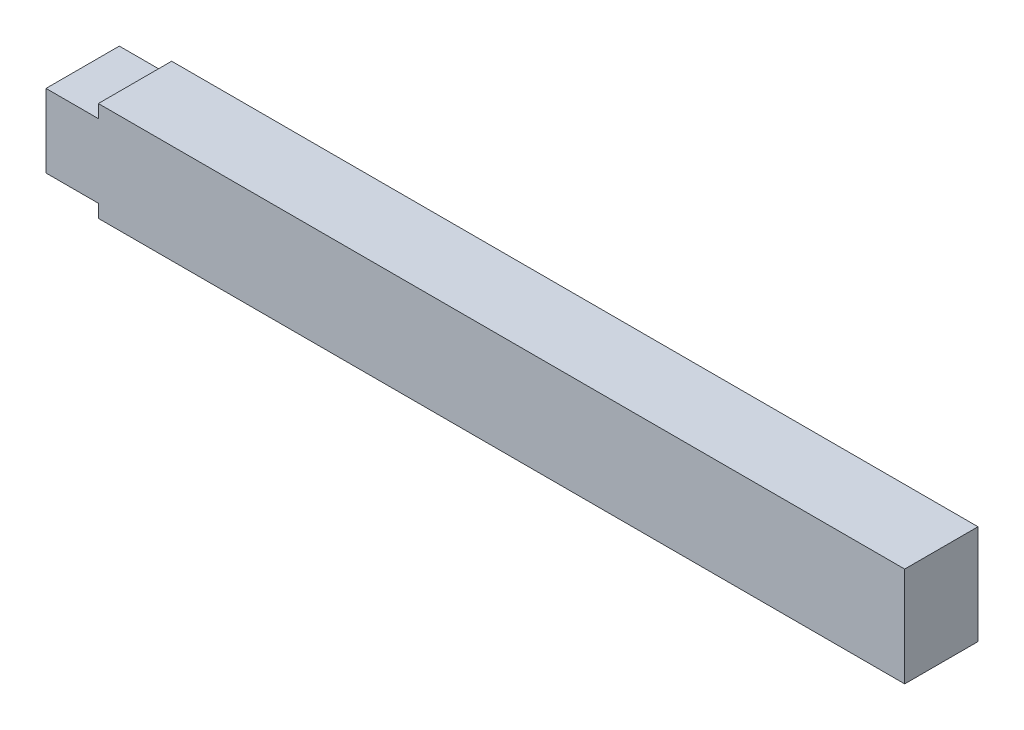
ISO-10303-21;
HEADER;
FILE_DESCRIPTION(('STEP AP214'),'2;1');
FILE_NAME('part.step','',(''),(''),'','','');
FILE_SCHEMA(('AUTOMOTIVE_DESIGN { 1 0 10303 214 1 1 1 1 }'));
ENDSEC;
DATA;
#1=APPLICATION_CONTEXT('core data for automotive mechanical design processes');
#2=APPLICATION_PROTOCOL_DEFINITION('international standard','automotive_design',2000,#1);
#3=PRODUCT_CONTEXT('',#1,'mechanical');
#4=PRODUCT('Part','Part','',(#3));
#5=PRODUCT_RELATED_PRODUCT_CATEGORY('part','',(#4));
#6=PRODUCT_DEFINITION_FORMATION('','',#4);
#7=PRODUCT_DEFINITION_CONTEXT('part definition',#1,'design');
#8=PRODUCT_DEFINITION('design','',#6,#7);
#9=PRODUCT_DEFINITION_SHAPE('','',#8);
#10=(LENGTH_UNIT() NAMED_UNIT(*) SI_UNIT(.MILLI.,.METRE.));
#11=(NAMED_UNIT(*) PLANE_ANGLE_UNIT() SI_UNIT($,.RADIAN.));
#12=(NAMED_UNIT(*) SI_UNIT($,.STERADIAN.) SOLID_ANGLE_UNIT());
#13=UNCERTAINTY_MEASURE_WITH_UNIT(LENGTH_MEASURE(1.E-05),#10,'distance_accuracy_value','');
#14=(GEOMETRIC_REPRESENTATION_CONTEXT(3) GLOBAL_UNCERTAINTY_ASSIGNED_CONTEXT((#13)) GLOBAL_UNIT_ASSIGNED_CONTEXT((#10,
#11,#12)) REPRESENTATION_CONTEXT('',''));
#15=CARTESIAN_POINT('',(0.,0.,0.));
#16=DIRECTION('',(0.,0.,1.));
#17=DIRECTION('',(1.,0.,0.));
#18=AXIS2_PLACEMENT_3D('',#15,#16,#17);
#19=CARTESIAN_POINT('',(-20.,50.,50.));
#20=DIRECTION('',(1.,0.,0.));
#21=DIRECTION('',(0.,1.,0.));
#22=AXIS2_PLACEMENT_3D('',#19,#20,#21);
#23=PLANE('',#22);
#24=DIRECTION('',(0.,-1.,0.));
#25=VECTOR('',#24,1.);
#26=CARTESIAN_POINT('',(-20.,75.,-70.));
#27=LINE('',#26,#25);
#28=CARTESIAN_POINT('',(-20.,95.,-70.));
#29=VERTEX_POINT('',#28);
#30=CARTESIAN_POINT('',(-20.,70.,-70.));
#31=VERTEX_POINT('',#30);
#32=EDGE_CURVE('E186',#29,#31,#27,.T.);
#33=ORIENTED_EDGE('',*,*,#32,.T.);
#34=DIRECTION('',(0.,0.,-1.));
#35=VECTOR('',#34,1.);
#36=CARTESIAN_POINT('',(-20.,70.,50.));
#37=LINE('',#36,#35);
#38=CARTESIAN_POINT('',(-20.,70.,70.));
#39=VERTEX_POINT('',#38);
#40=EDGE_CURVE('E180',#39,#31,#37,.T.);
#41=ORIENTED_EDGE('',*,*,#40,.F.);
#42=DIRECTION('',(0.,-1.,0.));
#43=VECTOR('',#42,1.);
#44=CARTESIAN_POINT('',(-20.,75.,70.));
#45=LINE('',#44,#43);
#46=CARTESIAN_POINT('',(-20.,95.,70.));
#47=VERTEX_POINT('',#46);
#48=EDGE_CURVE('E228',#47,#39,#45,.T.);
#49=ORIENTED_EDGE('',*,*,#48,.F.);
#50=DIRECTION('',(0.,0.,-1.));
#51=VECTOR('',#50,1.);
#52=CARTESIAN_POINT('',(-20.,95.,50.));
#53=LINE('',#52,#51);
#54=EDGE_CURVE('E225',#47,#29,#53,.T.);
#55=ORIENTED_EDGE('',*,*,#54,.T.);
#56=EDGE_LOOP('',(#33,#41,#49,#55));
#57=FACE_BOUND('',#56,.T.);
#58=ADVANCED_FACE('F33',(#57),#23,.F.);
#59=CARTESIAN_POINT('',(0.,70.,50.));
#60=DIRECTION('',(0.,-1.,0.));
#61=DIRECTION('',(0.,0.,-1.));
#62=AXIS2_PLACEMENT_3D('',#59,#60,#61);
#63=PLANE('',#62);
#64=DIRECTION('',(-1.,0.,0.));
#65=VECTOR('',#64,1.);
#66=CARTESIAN_POINT('',(0.,70.,-70.));
#67=LINE('',#66,#65);
#68=CARTESIAN_POINT('',(-120.,70.,-70.));
#69=VERTEX_POINT('',#68);
#70=EDGE_CURVE('E174',#31,#69,#67,.T.);
#71=ORIENTED_EDGE('',*,*,#70,.T.);
#72=DIRECTION('',(0.,0.,-1.));
#73=VECTOR('',#72,1.);
#74=CARTESIAN_POINT('',(-120.,70.,50.));
#75=LINE('',#74,#73);
#76=CARTESIAN_POINT('',(-120.,70.,70.));
#77=VERTEX_POINT('',#76);
#78=EDGE_CURVE('E177',#77,#69,#75,.T.);
#79=ORIENTED_EDGE('',*,*,#78,.F.);
#80=DIRECTION('',(-1.,0.,0.));
#81=VECTOR('',#80,1.);
#82=CARTESIAN_POINT('',(0.,70.,70.));
#83=LINE('',#82,#81);
#84=EDGE_CURVE('E204',#39,#77,#83,.T.);
#85=ORIENTED_EDGE('',*,*,#84,.F.);
#86=ORIENTED_EDGE('',*,*,#40,.T.);
#87=EDGE_LOOP('',(#71,#79,#85,#86));
#88=FACE_BOUND('',#87,.T.);
#89=ADVANCED_FACE('F176',(#88),#63,.F.);
#90=CARTESIAN_POINT('',(-120.,50.,50.));
#91=DIRECTION('',(1.,0.,0.));
#92=DIRECTION('',(0.,0.,-1.));
#93=AXIS2_PLACEMENT_3D('',#90,#91,#92);
#94=PLANE('',#93);
#95=DIRECTION('',(0.,-1.,0.));
#96=VECTOR('',#95,1.);
#97=CARTESIAN_POINT('',(-120.,75.,-70.));
#98=LINE('',#97,#96);
#99=CARTESIAN_POINT('',(-120.,-70.,-70.));
#100=VERTEX_POINT('',#99);
#101=EDGE_CURVE('E185',#69,#100,#98,.T.);
#102=ORIENTED_EDGE('',*,*,#101,.T.);
#103=DIRECTION('',(0.,0.,-1.));
#104=VECTOR('',#103,1.);
#105=CARTESIAN_POINT('',(-120.,-70.,50.));
#106=LINE('',#105,#104);
#107=CARTESIAN_POINT('',(-120.,-70.,70.));
#108=VERTEX_POINT('',#107);
#109=EDGE_CURVE('E193',#108,#100,#106,.T.);
#110=ORIENTED_EDGE('',*,*,#109,.F.);
#111=DIRECTION('',(0.,-1.,0.));
#112=VECTOR('',#111,1.);
#113=CARTESIAN_POINT('',(-120.,75.,70.));
#114=LINE('',#113,#112);
#115=EDGE_CURVE('E192',#77,#108,#114,.T.);
#116=ORIENTED_EDGE('',*,*,#115,.F.);
#117=ORIENTED_EDGE('',*,*,#78,.T.);
#118=EDGE_LOOP('',(#102,#110,#116,#117));
#119=FACE_BOUND('',#118,.T.);
#120=ADVANCED_FACE('F189',(#119),#94,.F.);
#121=CARTESIAN_POINT('',(-100.,-70.,50.));
#122=DIRECTION('',(0.,1.,0.));
#123=DIRECTION('',(-1.,0.,0.));
#124=AXIS2_PLACEMENT_3D('',#121,#122,#123);
#125=PLANE('',#124);
#126=DIRECTION('',(1.,0.,0.));
#127=VECTOR('',#126,1.);
#128=CARTESIAN_POINT('',(0.,-70.,-70.));
#129=LINE('',#128,#127);
#130=CARTESIAN_POINT('',(-20.,-70.,-70.));
#131=VERTEX_POINT('',#130);
#132=EDGE_CURVE('E198',#100,#131,#129,.T.);
#133=ORIENTED_EDGE('',*,*,#132,.T.);
#134=DIRECTION('',(0.,0.,-1.));
#135=VECTOR('',#134,1.);
#136=CARTESIAN_POINT('',(-20.,-70.,50.));
#137=LINE('',#136,#135);
#138=CARTESIAN_POINT('',(-20.,-70.,70.));
#139=VERTEX_POINT('',#138);
#140=EDGE_CURVE('E206',#139,#131,#137,.T.);
#141=ORIENTED_EDGE('',*,*,#140,.F.);
#142=DIRECTION('',(1.,0.,0.));
#143=VECTOR('',#142,1.);
#144=CARTESIAN_POINT('',(0.,-70.,70.));
#145=LINE('',#144,#143);
#146=EDGE_CURVE('E207',#108,#139,#145,.T.);
#147=ORIENTED_EDGE('',*,*,#146,.F.);
#148=ORIENTED_EDGE('',*,*,#109,.T.);
#149=EDGE_LOOP('',(#133,#141,#147,#148));
#150=FACE_BOUND('',#149,.T.);
#151=ADVANCED_FACE('F295',(#150),#125,.F.);
#152=CARTESIAN_POINT('',(-20.,-50.,50.));
#153=DIRECTION('',(1.,0.,0.));
#154=DIRECTION('',(0.,0.,-1.));
#155=AXIS2_PLACEMENT_3D('',#152,#153,#154);
#156=PLANE('',#155);
#157=DIRECTION('',(0.,-1.,0.));
#158=VECTOR('',#157,1.);
#159=CARTESIAN_POINT('',(-20.,75.,-70.));
#160=LINE('',#159,#158);
#161=CARTESIAN_POINT('',(-20.,-95.,-70.));
#162=VERTEX_POINT('',#161);
#163=EDGE_CURVE('E200',#131,#162,#160,.T.);
#164=ORIENTED_EDGE('',*,*,#163,.T.);
#165=DIRECTION('',(0.,0.,-1.));
#166=VECTOR('',#165,1.);
#167=CARTESIAN_POINT('',(-20.,-95.,50.));
#168=LINE('',#167,#166);
#169=CARTESIAN_POINT('',(-20.,-95.,70.));
#170=VERTEX_POINT('',#169);
#171=EDGE_CURVE('E211',#170,#162,#168,.T.);
#172=ORIENTED_EDGE('',*,*,#171,.F.);
#173=DIRECTION('',(0.,-1.,0.));
#174=VECTOR('',#173,1.);
#175=CARTESIAN_POINT('',(-20.,75.,70.));
#176=LINE('',#175,#174);
#177=EDGE_CURVE('E213',#139,#170,#176,.T.);
#178=ORIENTED_EDGE('',*,*,#177,.F.);
#179=ORIENTED_EDGE('',*,*,#140,.T.);
#180=EDGE_LOOP('',(#164,#172,#178,#179));
#181=FACE_BOUND('',#180,.T.);
#182=ADVANCED_FACE('F287',(#181),#156,.F.);
#183=CARTESIAN_POINT('',(1500.,-94.9999999999998,50.));
#184=DIRECTION('',(0.,1.,0.));
#185=DIRECTION('',(-1.,0.,0.));
#186=AXIS2_PLACEMENT_3D('',#183,#184,#185);
#187=PLANE('',#186);
#188=DIRECTION('',(1.,0.,0.));
#189=VECTOR('',#188,1.);
#190=CARTESIAN_POINT('',(0.,-95.,-70.));
#191=LINE('',#190,#189);
#192=CARTESIAN_POINT('',(1520.,-94.9999999999998,-70.));
#193=VERTEX_POINT('',#192);
#194=EDGE_CURVE('E146',#162,#193,#191,.T.);
#195=ORIENTED_EDGE('',*,*,#194,.T.);
#196=DIRECTION('',(0.,0.,-1.));
#197=VECTOR('',#196,1.);
#198=CARTESIAN_POINT('',(1520.,-94.9999999999999,50.));
#199=LINE('',#198,#197);
#200=CARTESIAN_POINT('',(1520.,-94.9999999999998,70.));
#201=VERTEX_POINT('',#200);
#202=EDGE_CURVE('E216',#201,#193,#199,.T.);
#203=ORIENTED_EDGE('',*,*,#202,.F.);
#204=DIRECTION('',(1.,0.,0.));
#205=VECTOR('',#204,1.);
#206=CARTESIAN_POINT('',(0.,-95.,70.));
#207=LINE('',#206,#205);
#208=EDGE_CURVE('E218',#170,#201,#207,.T.);
#209=ORIENTED_EDGE('',*,*,#208,.F.);
#210=ORIENTED_EDGE('',*,*,#171,.T.);
#211=EDGE_LOOP('',(#195,#203,#209,#210));
#212=FACE_BOUND('',#211,.T.);
#213=ADVANCED_FACE('F291',(#212),#187,.F.);
#214=CARTESIAN_POINT('',(1520.,75.,50.));
#215=DIRECTION('',(-1.,0.,0.));
#216=DIRECTION('',(0.,0.,1.));
#217=AXIS2_PLACEMENT_3D('',#214,#215,#216);
#218=PLANE('',#217);
#219=DIRECTION('',(0.,1.,0.));
#220=VECTOR('',#219,1.);
#221=CARTESIAN_POINT('',(1520.,75.,-70.));
#222=LINE('',#221,#220);
#223=CARTESIAN_POINT('',(1520.,95.,-70.));
#224=VERTEX_POINT('',#223);
#225=EDGE_CURVE('E138',#193,#224,#222,.T.);
#226=ORIENTED_EDGE('',*,*,#225,.T.);
#227=DIRECTION('',(0.,0.,-1.));
#228=VECTOR('',#227,1.);
#229=CARTESIAN_POINT('',(1520.,95.,50.));
#230=LINE('',#229,#228);
#231=CARTESIAN_POINT('',(1520.,95.,70.));
#232=VERTEX_POINT('',#231);
#233=EDGE_CURVE('E221',#232,#224,#230,.T.);
#234=ORIENTED_EDGE('',*,*,#233,.F.);
#235=DIRECTION('',(0.,1.,0.));
#236=VECTOR('',#235,1.);
#237=CARTESIAN_POINT('',(1520.,75.,70.));
#238=LINE('',#237,#236);
#239=EDGE_CURVE('E116',#201,#232,#238,.T.);
#240=ORIENTED_EDGE('',*,*,#239,.F.);
#241=ORIENTED_EDGE('',*,*,#202,.T.);
#242=EDGE_LOOP('',(#226,#234,#240,#241));
#243=FACE_BOUND('',#242,.T.);
#244=ADVANCED_FACE('F336',(#243),#218,.F.);
#245=CARTESIAN_POINT('',(0.,95.,50.));
#246=DIRECTION('',(0.,-1.,0.));
#247=DIRECTION('',(0.,0.,-1.));
#248=AXIS2_PLACEMENT_3D('',#245,#246,#247);
#249=PLANE('',#248);
#250=DIRECTION('',(-1.,0.,0.));
#251=VECTOR('',#250,1.);
#252=CARTESIAN_POINT('',(0.,95.,-70.));
#253=LINE('',#252,#251);
#254=EDGE_CURVE('E128',#224,#29,#253,.T.);
#255=ORIENTED_EDGE('',*,*,#254,.T.);
#256=ORIENTED_EDGE('',*,*,#54,.F.);
#257=DIRECTION('',(-1.,0.,0.));
#258=VECTOR('',#257,1.);
#259=CARTESIAN_POINT('',(0.,95.,70.));
#260=LINE('',#259,#258);
#261=EDGE_CURVE('E110',#232,#47,#260,.T.);
#262=ORIENTED_EDGE('',*,*,#261,.F.);
#263=ORIENTED_EDGE('',*,*,#233,.T.);
#264=EDGE_LOOP('',(#255,#256,#262,#263));
#265=FACE_BOUND('',#264,.T.);
#266=ADVANCED_FACE('F345',(#265),#249,.F.);
#267=CARTESIAN_POINT('',(0.,75.,70.));
#268=DIRECTION('',(0.,0.,-1.));
#269=DIRECTION('',(-1.,0.,0.));
#270=AXIS2_PLACEMENT_3D('',#267,#268,#269);
#271=PLANE('',#270);
#272=ORIENTED_EDGE('',*,*,#48,.T.);
#273=ORIENTED_EDGE('',*,*,#84,.T.);
#274=ORIENTED_EDGE('',*,*,#115,.T.);
#275=ORIENTED_EDGE('',*,*,#146,.T.);
#276=ORIENTED_EDGE('',*,*,#177,.T.);
#277=ORIENTED_EDGE('',*,*,#208,.T.);
#278=ORIENTED_EDGE('',*,*,#239,.T.);
#279=ORIENTED_EDGE('',*,*,#261,.T.);
#280=EDGE_LOOP('',(#272,#273,#274,#275,#276,#277,#278,#279));
#281=FACE_BOUND('',#280,.T.);
#282=ADVANCED_FACE('F292',(#281),#271,.F.);
#283=CARTESIAN_POINT('',(0.,75.,-70.));
#284=DIRECTION('',(0.,0.,-1.));
#285=DIRECTION('',(-1.,0.,0.));
#286=AXIS2_PLACEMENT_3D('',#283,#284,#285);
#287=PLANE('',#286);
#288=ORIENTED_EDGE('',*,*,#32,.F.);
#289=ORIENTED_EDGE('',*,*,#254,.F.);
#290=ORIENTED_EDGE('',*,*,#225,.F.);
#291=ORIENTED_EDGE('',*,*,#194,.F.);
#292=ORIENTED_EDGE('',*,*,#163,.F.);
#293=ORIENTED_EDGE('',*,*,#132,.F.);
#294=ORIENTED_EDGE('',*,*,#101,.F.);
#295=ORIENTED_EDGE('',*,*,#70,.F.);
#296=EDGE_LOOP('',(#288,#289,#290,#291,#292,#293,#294,#295));
#297=FACE_BOUND('',#296,.T.);
#298=ADVANCED_FACE('F196',(#297),#287,.T.);
#299=CLOSED_SHELL('',(#58,#89,#120,#151,#182,#213,#244,#266,#282,#298));
#300=CARTESIAN_POINT('',(0.,50.,50.));
#301=DIRECTION('',(1.,0.,0.));
#302=DIRECTION('',(0.,1.,0.));
#303=AXIS2_PLACEMENT_3D('',#300,#301,#302);
#304=PLANE('',#303);
#305=DIRECTION('',(0.,-1.,0.));
#306=VECTOR('',#305,1.);
#307=CARTESIAN_POINT('',(0.,50.,-50.));
#308=LINE('',#307,#306);
#309=CARTESIAN_POINT('',(0.,75.,-50.));
#310=VERTEX_POINT('',#309);
#311=CARTESIAN_POINT('',(0.,50.,-50.));
#312=VERTEX_POINT('',#311);
#313=EDGE_CURVE('E37',#310,#312,#308,.T.);
#314=ORIENTED_EDGE('',*,*,#313,.F.);
#315=DIRECTION('',(0.,0.,-1.));
#316=VECTOR('',#315,1.);
#317=CARTESIAN_POINT('',(0.,75.,50.));
#318=LINE('',#317,#316);
#319=CARTESIAN_POINT('',(0.,75.,50.));
#320=VERTEX_POINT('',#319);
#321=EDGE_CURVE('E273',#320,#310,#318,.T.);
#322=ORIENTED_EDGE('',*,*,#321,.F.);
#323=DIRECTION('',(0.,-1.,0.));
#324=VECTOR('',#323,1.);
#325=CARTESIAN_POINT('',(0.,50.,50.));
#326=LINE('',#325,#324);
#327=CARTESIAN_POINT('',(0.,50.,50.));
#328=VERTEX_POINT('',#327);
#329=EDGE_CURVE('E240',#320,#328,#326,.T.);
#330=ORIENTED_EDGE('',*,*,#329,.T.);
#331=DIRECTION('',(0.,0.,-1.));
#332=VECTOR('',#331,1.);
#333=CARTESIAN_POINT('',(0.,50.,50.));
#334=LINE('',#333,#332);
#335=EDGE_CURVE('E271',#328,#312,#334,.T.);
#336=ORIENTED_EDGE('',*,*,#335,.T.);
#337=EDGE_LOOP('',(#314,#322,#330,#336));
#338=FACE_BOUND('',#337,.T.);
#339=ADVANCED_FACE('F375',(#338),#304,.T.);
#340=CARTESIAN_POINT('',(0.,50.,50.));
#341=DIRECTION('',(0.,-1.,0.));
#342=DIRECTION('',(0.,0.,-1.));
#343=AXIS2_PLACEMENT_3D('',#340,#341,#342);
#344=PLANE('',#343);
#345=DIRECTION('',(-1.,0.,0.));
#346=VECTOR('',#345,1.);
#347=CARTESIAN_POINT('',(0.,50.,-50.));
#348=LINE('',#347,#346);
#349=CARTESIAN_POINT('',(-100.,50.,-50.));
#350=VERTEX_POINT('',#349);
#351=EDGE_CURVE('E53',#312,#350,#348,.T.);
#352=ORIENTED_EDGE('',*,*,#351,.F.);
#353=ORIENTED_EDGE('',*,*,#335,.F.);
#354=DIRECTION('',(-1.,0.,0.));
#355=VECTOR('',#354,1.);
#356=CARTESIAN_POINT('',(0.,50.,50.));
#357=LINE('',#356,#355);
#358=CARTESIAN_POINT('',(-100.,50.,50.));
#359=VERTEX_POINT('',#358);
#360=EDGE_CURVE('E100',#328,#359,#357,.T.);
#361=ORIENTED_EDGE('',*,*,#360,.T.);
#362=DIRECTION('',(0.,0.,-1.));
#363=VECTOR('',#362,1.);
#364=CARTESIAN_POINT('',(-100.,50.,50.));
#365=LINE('',#364,#363);
#366=EDGE_CURVE('E267',#359,#350,#365,.T.);
#367=ORIENTED_EDGE('',*,*,#366,.T.);
#368=EDGE_LOOP('',(#352,#353,#361,#367));
#369=FACE_BOUND('',#368,.T.);
#370=ADVANCED_FACE('F380',(#369),#344,.T.);
#371=CARTESIAN_POINT('',(-100.,50.,50.));
#372=DIRECTION('',(1.,0.,0.));
#373=DIRECTION('',(0.,0.,-1.));
#374=AXIS2_PLACEMENT_3D('',#371,#372,#373);
#375=PLANE('',#374);
#376=DIRECTION('',(0.,-1.,0.));
#377=VECTOR('',#376,1.);
#378=CARTESIAN_POINT('',(-100.,50.,-50.));
#379=LINE('',#378,#377);
#380=CARTESIAN_POINT('',(-100.,-50.,-50.));
#381=VERTEX_POINT('',#380);
#382=EDGE_CURVE('E269',#350,#381,#379,.T.);
#383=ORIENTED_EDGE('',*,*,#382,.F.);
#384=ORIENTED_EDGE('',*,*,#366,.F.);
#385=DIRECTION('',(0.,-1.,0.));
#386=VECTOR('',#385,1.);
#387=CARTESIAN_POINT('',(-100.,50.,50.));
#388=LINE('',#387,#386);
#389=CARTESIAN_POINT('',(-100.,-50.,50.));
#390=VERTEX_POINT('',#389);
#391=EDGE_CURVE('E237',#359,#390,#388,.T.);
#392=ORIENTED_EDGE('',*,*,#391,.T.);
#393=DIRECTION('',(0.,0.,-1.));
#394=VECTOR('',#393,1.);
#395=CARTESIAN_POINT('',(-100.,-50.,50.));
#396=LINE('',#395,#394);
#397=EDGE_CURVE('E262',#390,#381,#396,.T.);
#398=ORIENTED_EDGE('',*,*,#397,.T.);
#399=EDGE_LOOP('',(#383,#384,#392,#398));
#400=FACE_BOUND('',#399,.T.);
#401=ADVANCED_FACE('F393',(#400),#375,.T.);
#402=CARTESIAN_POINT('',(-100.,-50.,50.));
#403=DIRECTION('',(0.,1.,0.));
#404=DIRECTION('',(-1.,0.,0.));
#405=AXIS2_PLACEMENT_3D('',#402,#403,#404);
#406=PLANE('',#405);
#407=DIRECTION('',(1.,0.,0.));
#408=VECTOR('',#407,1.);
#409=CARTESIAN_POINT('',(-100.,-50.,-50.));
#410=LINE('',#409,#408);
#411=CARTESIAN_POINT('',(0.,-50.,-50.));
#412=VERTEX_POINT('',#411);
#413=EDGE_CURVE('E265',#381,#412,#410,.T.);
#414=ORIENTED_EDGE('',*,*,#413,.F.);
#415=ORIENTED_EDGE('',*,*,#397,.F.);
#416=DIRECTION('',(1.,0.,0.));
#417=VECTOR('',#416,1.);
#418=CARTESIAN_POINT('',(-100.,-50.,50.));
#419=LINE('',#418,#417);
#420=CARTESIAN_POINT('',(0.,-50.,50.));
#421=VERTEX_POINT('',#420);
#422=EDGE_CURVE('E235',#390,#421,#419,.T.);
#423=ORIENTED_EDGE('',*,*,#422,.T.);
#424=DIRECTION('',(0.,0.,-1.));
#425=VECTOR('',#424,1.);
#426=CARTESIAN_POINT('',(0.,-50.,50.));
#427=LINE('',#426,#425);
#428=EDGE_CURVE('E257',#421,#412,#427,.T.);
#429=ORIENTED_EDGE('',*,*,#428,.T.);
#430=EDGE_LOOP('',(#414,#415,#423,#429));
#431=FACE_BOUND('',#430,.T.);
#432=ADVANCED_FACE('F403',(#431),#406,.T.);
#433=CARTESIAN_POINT('',(0.,-50.,50.));
#434=DIRECTION('',(1.,0.,0.));
#435=DIRECTION('',(0.,0.,-1.));
#436=AXIS2_PLACEMENT_3D('',#433,#434,#435);
#437=PLANE('',#436);
#438=DIRECTION('',(0.,-1.,0.));
#439=VECTOR('',#438,1.);
#440=CARTESIAN_POINT('',(0.,-50.,-50.));
#441=LINE('',#440,#439);
#442=CARTESIAN_POINT('',(0.,-75.,-50.));
#443=VERTEX_POINT('',#442);
#444=EDGE_CURVE('E260',#412,#443,#441,.T.);
#445=ORIENTED_EDGE('',*,*,#444,.F.);
#446=ORIENTED_EDGE('',*,*,#428,.F.);
#447=DIRECTION('',(0.,-1.,0.));
#448=VECTOR('',#447,1.);
#449=CARTESIAN_POINT('',(0.,-50.,50.));
#450=LINE('',#449,#448);
#451=CARTESIAN_POINT('',(0.,-75.,50.));
#452=VERTEX_POINT('',#451);
#453=EDGE_CURVE('E233',#421,#452,#450,.T.);
#454=ORIENTED_EDGE('',*,*,#453,.T.);
#455=DIRECTION('',(0.,0.,-1.));
#456=VECTOR('',#455,1.);
#457=CARTESIAN_POINT('',(0.,-75.,50.));
#458=LINE('',#457,#456);
#459=EDGE_CURVE('E252',#452,#443,#458,.T.);
#460=ORIENTED_EDGE('',*,*,#459,.T.);
#461=EDGE_LOOP('',(#445,#446,#454,#460));
#462=FACE_BOUND('',#461,.T.);
#463=ADVANCED_FACE('F414',(#462),#437,.T.);
#464=CARTESIAN_POINT('',(1500.,-74.9999999999998,50.));
#465=DIRECTION('',(0.,1.,0.));
#466=DIRECTION('',(-1.,0.,0.));
#467=AXIS2_PLACEMENT_3D('',#464,#465,#466);
#468=PLANE('',#467);
#469=DIRECTION('',(1.,0.,0.));
#470=VECTOR('',#469,1.);
#471=CARTESIAN_POINT('',(1500.,-74.9999999999998,-50.));
#472=LINE('',#471,#470);
#473=CARTESIAN_POINT('',(1500.,-74.9999999999998,-50.));
#474=VERTEX_POINT('',#473);
#475=EDGE_CURVE('E255',#443,#474,#472,.T.);
#476=ORIENTED_EDGE('',*,*,#475,.F.);
#477=ORIENTED_EDGE('',*,*,#459,.F.);
#478=DIRECTION('',(1.,0.,0.));
#479=VECTOR('',#478,1.);
#480=CARTESIAN_POINT('',(1500.,-74.9999999999998,50.));
#481=LINE('',#480,#479);
#482=CARTESIAN_POINT('',(1500.,-74.9999999999998,50.));
#483=VERTEX_POINT('',#482);
#484=EDGE_CURVE('E231',#452,#483,#481,.T.);
#485=ORIENTED_EDGE('',*,*,#484,.T.);
#486=DIRECTION('',(0.,0.,-1.));
#487=VECTOR('',#486,1.);
#488=CARTESIAN_POINT('',(1500.,-74.9999999999998,50.));
#489=LINE('',#488,#487);
#490=EDGE_CURVE('E247',#483,#474,#489,.T.);
#491=ORIENTED_EDGE('',*,*,#490,.T.);
#492=EDGE_LOOP('',(#476,#477,#485,#491));
#493=FACE_BOUND('',#492,.T.);
#494=ADVANCED_FACE('F425',(#493),#468,.T.);
#495=CARTESIAN_POINT('',(1500.,75.,50.));
#496=DIRECTION('',(-1.,0.,0.));
#497=DIRECTION('',(0.,0.,1.));
#498=AXIS2_PLACEMENT_3D('',#495,#496,#497);
#499=PLANE('',#498);
#500=DIRECTION('',(0.,1.,0.));
#501=VECTOR('',#500,1.);
#502=CARTESIAN_POINT('',(1500.,75.,-50.));
#503=LINE('',#502,#501);
#504=CARTESIAN_POINT('',(1500.,75.,-50.));
#505=VERTEX_POINT('',#504);
#506=EDGE_CURVE('E250',#474,#505,#503,.T.);
#507=ORIENTED_EDGE('',*,*,#506,.F.);
#508=ORIENTED_EDGE('',*,*,#490,.F.);
#509=DIRECTION('',(0.,1.,0.));
#510=VECTOR('',#509,1.);
#511=CARTESIAN_POINT('',(1500.,75.,50.));
#512=LINE('',#511,#510);
#513=CARTESIAN_POINT('',(1500.,75.,50.));
#514=VERTEX_POINT('',#513);
#515=EDGE_CURVE('E44',#483,#514,#512,.T.);
#516=ORIENTED_EDGE('',*,*,#515,.T.);
#517=DIRECTION('',(0.,0.,-1.));
#518=VECTOR('',#517,1.);
#519=CARTESIAN_POINT('',(1500.,75.,50.));
#520=LINE('',#519,#518);
#521=EDGE_CURVE('E242',#514,#505,#520,.T.);
#522=ORIENTED_EDGE('',*,*,#521,.T.);
#523=EDGE_LOOP('',(#507,#508,#516,#522));
#524=FACE_BOUND('',#523,.T.);
#525=ADVANCED_FACE('F436',(#524),#499,.T.);
#526=CARTESIAN_POINT('',(0.,75.,50.));
#527=DIRECTION('',(0.,-1.,0.));
#528=DIRECTION('',(0.,0.,-1.));
#529=AXIS2_PLACEMENT_3D('',#526,#527,#528);
#530=PLANE('',#529);
#531=DIRECTION('',(-1.,0.,0.));
#532=VECTOR('',#531,1.);
#533=CARTESIAN_POINT('',(0.,75.,-50.));
#534=LINE('',#533,#532);
#535=EDGE_CURVE('E245',#505,#310,#534,.T.);
#536=ORIENTED_EDGE('',*,*,#535,.F.);
#537=ORIENTED_EDGE('',*,*,#521,.F.);
#538=DIRECTION('',(-1.,0.,0.));
#539=VECTOR('',#538,1.);
#540=CARTESIAN_POINT('',(0.,75.,50.));
#541=LINE('',#540,#539);
#542=EDGE_CURVE('E11',#514,#320,#541,.T.);
#543=ORIENTED_EDGE('',*,*,#542,.T.);
#544=ORIENTED_EDGE('',*,*,#321,.T.);
#545=EDGE_LOOP('',(#536,#537,#543,#544));
#546=FACE_BOUND('',#545,.T.);
#547=ADVANCED_FACE('F447',(#546),#530,.T.);
#548=CARTESIAN_POINT('',(0.,75.,50.));
#549=DIRECTION('',(0.,0.,-1.));
#550=DIRECTION('',(-1.,0.,0.));
#551=AXIS2_PLACEMENT_3D('',#548,#549,#550);
#552=PLANE('',#551);
#553=ORIENTED_EDGE('',*,*,#329,.F.);
#554=ORIENTED_EDGE('',*,*,#542,.F.);
#555=ORIENTED_EDGE('',*,*,#515,.F.);
#556=ORIENTED_EDGE('',*,*,#484,.F.);
#557=ORIENTED_EDGE('',*,*,#453,.F.);
#558=ORIENTED_EDGE('',*,*,#422,.F.);
#559=ORIENTED_EDGE('',*,*,#391,.F.);
#560=ORIENTED_EDGE('',*,*,#360,.F.);
#561=EDGE_LOOP('',(#553,#554,#555,#556,#557,#558,#559,#560));
#562=FACE_BOUND('',#561,.T.);
#563=ADVANCED_FACE('F458',(#562),#552,.T.);
#564=CARTESIAN_POINT('',(0.,75.,-50.));
#565=DIRECTION('',(0.,0.,-1.));
#566=DIRECTION('',(-1.,0.,0.));
#567=AXIS2_PLACEMENT_3D('',#564,#565,#566);
#568=PLANE('',#567);
#569=ORIENTED_EDGE('',*,*,#313,.T.);
#570=ORIENTED_EDGE('',*,*,#351,.T.);
#571=ORIENTED_EDGE('',*,*,#382,.T.);
#572=ORIENTED_EDGE('',*,*,#413,.T.);
#573=ORIENTED_EDGE('',*,*,#444,.T.);
#574=ORIENTED_EDGE('',*,*,#475,.T.);
#575=ORIENTED_EDGE('',*,*,#506,.T.);
#576=ORIENTED_EDGE('',*,*,#535,.T.);
#577=EDGE_LOOP('',(#569,#570,#571,#572,#573,#574,#575,#576));
#578=FACE_BOUND('',#577,.T.);
#579=ADVANCED_FACE('F35',(#578),#568,.F.);
#580=CLOSED_SHELL('',(#339,#370,#401,#432,#463,#494,#525,#547,#563,#579));
#581=ORIENTED_CLOSED_SHELL('',*,#580,.T.);
#582=BREP_WITH_VOIDS('B2',#299,(#581));
#583=ADVANCED_BREP_SHAPE_REPRESENTATION('',(#18,#582),#14);
#584=SHAPE_DEFINITION_REPRESENTATION(#9,#583);
ENDSEC;
END-ISO-10303-21;
